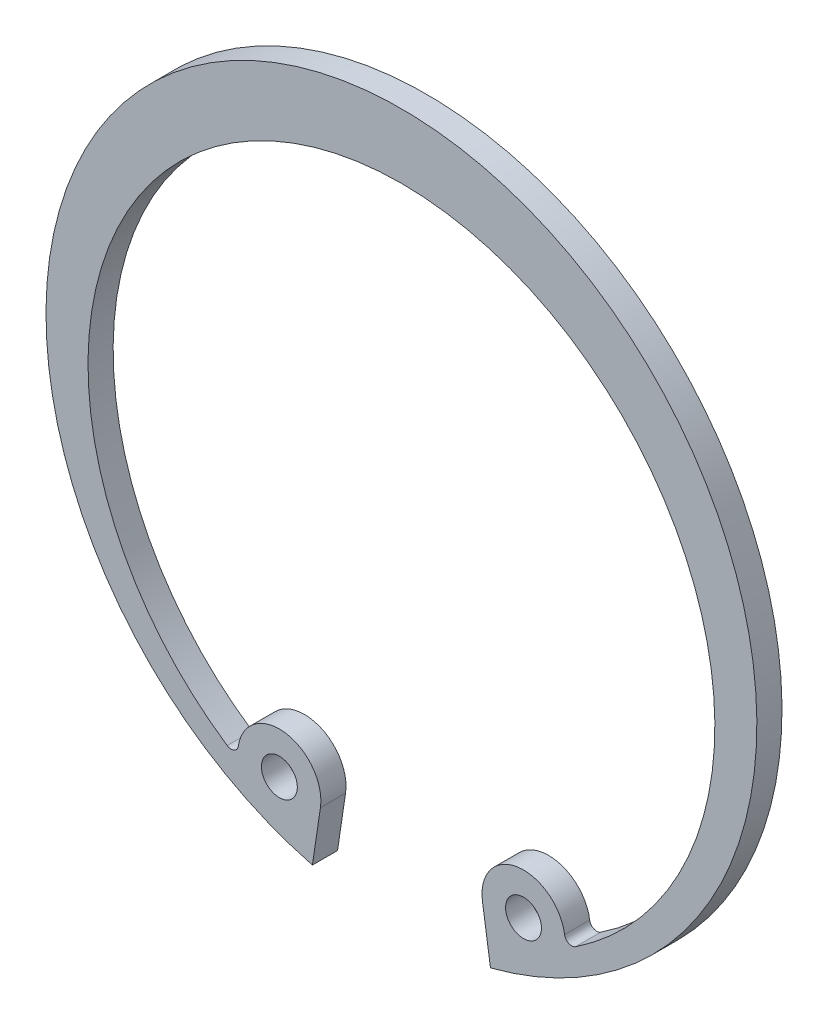
ISO-10303-21;
HEADER;
FILE_DESCRIPTION(('STEP AP214'),'2;1');
FILE_NAME('part.step','',(''),(''),'','','');
FILE_SCHEMA(('AUTOMOTIVE_DESIGN { 1 0 10303 214 1 1 1 1 }'));
ENDSEC;
DATA;
#1=APPLICATION_CONTEXT('core data for automotive mechanical design processes');
#2=APPLICATION_PROTOCOL_DEFINITION('international standard','automotive_design',2000,#1);
#3=PRODUCT_CONTEXT('',#1,'mechanical');
#4=PRODUCT('Part','Part','',(#3));
#5=PRODUCT_RELATED_PRODUCT_CATEGORY('part','',(#4));
#6=PRODUCT_DEFINITION_FORMATION('','',#4);
#7=PRODUCT_DEFINITION_CONTEXT('part definition',#1,'design');
#8=PRODUCT_DEFINITION('design','',#6,#7);
#9=PRODUCT_DEFINITION_SHAPE('','',#8);
#10=(LENGTH_UNIT() NAMED_UNIT(*) SI_UNIT(.MILLI.,.METRE.));
#11=(NAMED_UNIT(*) PLANE_ANGLE_UNIT() SI_UNIT($,.RADIAN.));
#12=(NAMED_UNIT(*) SI_UNIT($,.STERADIAN.) SOLID_ANGLE_UNIT());
#13=UNCERTAINTY_MEASURE_WITH_UNIT(LENGTH_MEASURE(1.E-05),#10,'distance_accuracy_value','');
#14=(GEOMETRIC_REPRESENTATION_CONTEXT(3) GLOBAL_UNCERTAINTY_ASSIGNED_CONTEXT((#13)) GLOBAL_UNIT_ASSIGNED_CONTEXT((#10,
#11,#12)) REPRESENTATION_CONTEXT('',''));
#15=CARTESIAN_POINT('',(0.,0.,0.));
#16=DIRECTION('',(0.,0.,1.));
#17=DIRECTION('',(1.,0.,0.));
#18=AXIS2_PLACEMENT_3D('',#15,#16,#17);
#19=CARTESIAN_POINT('',(-8.5,-19.7928377926956,1.75));
#20=DIRECTION('',(0.,0.,1.));
#21=DIRECTION('',(1.,0.,0.));
#22=AXIS2_PLACEMENT_3D('',#19,#20,#21);
#23=PLANE('',#22);
#24=CARTESIAN_POINT('',(-8.5,-19.7928377926956,1.75));
#25=DIRECTION('',(0.,0.,1.));
#26=DIRECTION('',(1.,0.,0.));
#27=AXIS2_PLACEMENT_3D('',#24,#25,#26);
#28=CIRCLE('',#27,1.25);
#29=CARTESIAN_POINT('',(-7.25,-19.7928377926956,1.75));
#30=VERTEX_POINT('',#29);
#31=EDGE_CURVE('E136',#30,#30,#28,.T.);
#32=ORIENTED_EDGE('',*,*,#31,.F.);
#33=EDGE_LOOP('',(#32));
#34=FACE_BOUND('',#33,.T.);
#35=CARTESIAN_POINT('',(-8.5,-19.7928377926956,1.75));
#36=DIRECTION('',(0.,0.,1.));
#37=DIRECTION('',(1.,0.,0.));
#38=AXIS2_PLACEMENT_3D('',#35,#36,#37);
#39=CIRCLE('',#38,2.89080843162481);
#40=CARTESIAN_POINT('',(-5.64094460318268,-20.2201264846626,1.75));
#41=VERTEX_POINT('',#40);
#42=CARTESIAN_POINT('',(-11.3602513121852,-19.3736292294532,1.75));
#43=VERTEX_POINT('',#42);
#44=EDGE_CURVE('E147',#41,#43,#39,.T.);
#45=ORIENTED_EDGE('',*,*,#44,.T.);
#46=CARTESIAN_POINT('',(-11.8549660917768,-19.3011220790906,1.75));
#47=DIRECTION('',(0.,0.,-1.));
#48=DIRECTION('',(1.,0.,0.));
#49=AXIS2_PLACEMENT_3D('',#46,#47,#48);
#50=CIRCLE('',#49,0.500000000000004);
#51=CARTESIAN_POINT('',(-12.1329254374222,-19.7167404162322,1.75));
#52=VERTEX_POINT('',#51);
#53=EDGE_CURVE('E95',#43,#52,#50,.T.);
#54=ORIENTED_EDGE('',*,*,#53,.T.);
#55=CARTESIAN_POINT('',(0.,-1.575,1.75));
#56=DIRECTION('',(0.,0.,-1.));
#57=DIRECTION('',(1.,0.,0.));
#58=AXIS2_PLACEMENT_3D('',#55,#56,#57);
#59=CIRCLE('',#58,21.825);
#60=CARTESIAN_POINT('',(12.1329254374222,-19.7167404162322,1.75));
#61=VERTEX_POINT('',#60);
#62=EDGE_CURVE('E162',#52,#61,#59,.T.);
#63=ORIENTED_EDGE('',*,*,#62,.T.);
#64=CARTESIAN_POINT('',(11.8549660917768,-19.3011220790906,1.75));
#65=DIRECTION('',(0.,0.,-1.));
#66=DIRECTION('',(-1.,0.,0.));
#67=AXIS2_PLACEMENT_3D('',#64,#65,#66);
#68=CIRCLE('',#67,0.500000000000004);
#69=CARTESIAN_POINT('',(11.3602513121852,-19.3736292294532,1.75));
#70=VERTEX_POINT('',#69);
#71=EDGE_CURVE('E175',#61,#70,#68,.T.);
#72=ORIENTED_EDGE('',*,*,#71,.T.);
#73=CARTESIAN_POINT('',(8.5,-19.7928377926956,1.75));
#74=DIRECTION('',(0.,0.,1.));
#75=DIRECTION('',(1.,0.,0.));
#76=AXIS2_PLACEMENT_3D('',#73,#74,#75);
#77=CIRCLE('',#76,2.89080843162481);
#78=CARTESIAN_POINT('',(5.64094460318268,-20.2201264846626,1.75));
#79=VERTEX_POINT('',#78);
#80=EDGE_CURVE('E114',#70,#79,#77,.T.);
#81=ORIENTED_EDGE('',*,*,#80,.T.);
#82=DIRECTION('',(0.147809411129611,-0.989015863361917,0.));
#83=VECTOR('',#82,1.);
#84=CARTESIAN_POINT('',(5.64094460318268,-20.2201264846626,1.75));
#85=LINE('',#84,#83);
#86=CARTESIAN_POINT('',(6.19999999999999,-23.9608534906418,1.75));
#87=VERTEX_POINT('',#86);
#88=EDGE_CURVE('E108',#79,#87,#85,.T.);
#89=ORIENTED_EDGE('',*,*,#88,.T.);
#90=CARTESIAN_POINT('',(0.,0.,1.75));
#91=DIRECTION('',(0.,0.,1.));
#92=DIRECTION('',(1.,0.,0.));
#93=AXIS2_PLACEMENT_3D('',#90,#91,#92);
#94=CIRCLE('',#93,24.75);
#95=CARTESIAN_POINT('',(-6.2,-23.9608534906418,1.75));
#96=VERTEX_POINT('',#95);
#97=EDGE_CURVE('E112',#87,#96,#94,.T.);
#98=ORIENTED_EDGE('',*,*,#97,.T.);
#99=DIRECTION('',(0.147809411129611,0.989015863361917,0.));
#100=VECTOR('',#99,1.);
#101=CARTESIAN_POINT('',(-5.64094460318268,-20.2201264846626,1.75));
#102=LINE('',#101,#100);
#103=EDGE_CURVE('E52',#96,#41,#102,.T.);
#104=ORIENTED_EDGE('',*,*,#103,.T.);
#105=EDGE_LOOP('',(#45,#54,#63,#72,#81,#89,#98,#104));
#106=FACE_BOUND('',#105,.T.);
#107=CARTESIAN_POINT('',(8.5,-19.7928377926956,1.75));
#108=DIRECTION('',(0.,0.,1.));
#109=DIRECTION('',(1.,0.,0.));
#110=AXIS2_PLACEMENT_3D('',#107,#108,#109);
#111=CIRCLE('',#110,1.25);
#112=CARTESIAN_POINT('',(9.75,-19.7928377926956,1.75));
#113=VERTEX_POINT('',#112);
#114=EDGE_CURVE('E184',#113,#113,#111,.T.);
#115=ORIENTED_EDGE('',*,*,#114,.F.);
#116=EDGE_LOOP('',(#115));
#117=FACE_BOUND('',#116,.T.);
#118=ADVANCED_FACE('F35',(#34,#106,#117),#23,.T.);
#119=CARTESIAN_POINT('',(-8.5,-19.7928377926956,0.));
#120=DIRECTION('',(0.,0.,1.));
#121=DIRECTION('',(1.,0.,0.));
#122=AXIS2_PLACEMENT_3D('',#119,#120,#121);
#123=PLANE('',#122);
#124=CARTESIAN_POINT('',(-8.5,-19.7928377926956,0.));
#125=DIRECTION('',(0.,0.,1.));
#126=DIRECTION('',(1.,0.,0.));
#127=AXIS2_PLACEMENT_3D('',#124,#125,#126);
#128=CIRCLE('',#127,2.89080843162481);
#129=CARTESIAN_POINT('',(-5.64094460318268,-20.2201264846626,0.));
#130=VERTEX_POINT('',#129);
#131=CARTESIAN_POINT('',(-11.3602513121852,-19.3736292294532,0.));
#132=VERTEX_POINT('',#131);
#133=EDGE_CURVE('E132',#130,#132,#128,.T.);
#134=ORIENTED_EDGE('',*,*,#133,.F.);
#135=DIRECTION('',(0.147809411129611,0.989015863361917,0.));
#136=VECTOR('',#135,1.);
#137=CARTESIAN_POINT('',(-5.64094460318268,-20.2201264846626,0.));
#138=LINE('',#137,#136);
#139=CARTESIAN_POINT('',(-6.2,-23.9608534906418,0.));
#140=VERTEX_POINT('',#139);
#141=EDGE_CURVE('E87',#140,#130,#138,.T.);
#142=ORIENTED_EDGE('',*,*,#141,.F.);
#143=CARTESIAN_POINT('',(0.,0.,0.));
#144=DIRECTION('',(0.,0.,1.));
#145=DIRECTION('',(1.,0.,0.));
#146=AXIS2_PLACEMENT_3D('',#143,#144,#145);
#147=CIRCLE('',#146,24.75);
#148=CARTESIAN_POINT('',(6.19999999999999,-23.9608534906418,0.));
#149=VERTEX_POINT('',#148);
#150=EDGE_CURVE('E81',#149,#140,#147,.T.);
#151=ORIENTED_EDGE('',*,*,#150,.F.);
#152=DIRECTION('',(0.147809411129611,-0.989015863361917,0.));
#153=VECTOR('',#152,1.);
#154=CARTESIAN_POINT('',(5.64094460318268,-20.2201264846626,0.));
#155=LINE('',#154,#153);
#156=CARTESIAN_POINT('',(5.64094460318268,-20.2201264846626,0.));
#157=VERTEX_POINT('',#156);
#158=EDGE_CURVE('E122',#157,#149,#155,.T.);
#159=ORIENTED_EDGE('',*,*,#158,.F.);
#160=CARTESIAN_POINT('',(8.5,-19.7928377926956,0.));
#161=DIRECTION('',(0.,0.,1.));
#162=DIRECTION('',(1.,0.,0.));
#163=AXIS2_PLACEMENT_3D('',#160,#161,#162);
#164=CIRCLE('',#163,2.89080843162481);
#165=CARTESIAN_POINT('',(11.3602513121852,-19.3736292294532,0.));
#166=VERTEX_POINT('',#165);
#167=EDGE_CURVE('E142',#166,#157,#164,.T.);
#168=ORIENTED_EDGE('',*,*,#167,.F.);
#169=CARTESIAN_POINT('',(11.8549660917768,-19.3011220790906,0.));
#170=DIRECTION('',(0.,0.,-1.));
#171=DIRECTION('',(-1.,0.,0.));
#172=AXIS2_PLACEMENT_3D('',#169,#170,#171);
#173=CIRCLE('',#172,0.500000000000004);
#174=CARTESIAN_POINT('',(12.1329254374222,-19.7167404162322,0.));
#175=VERTEX_POINT('',#174);
#176=EDGE_CURVE('E140',#175,#166,#173,.T.);
#177=ORIENTED_EDGE('',*,*,#176,.F.);
#178=CARTESIAN_POINT('',(0.,-1.575,0.));
#179=DIRECTION('',(0.,0.,-1.));
#180=DIRECTION('',(1.,0.,0.));
#181=AXIS2_PLACEMENT_3D('',#178,#179,#180);
#182=CIRCLE('',#181,21.825);
#183=CARTESIAN_POINT('',(-12.1329254374222,-19.7167404162322,0.));
#184=VERTEX_POINT('',#183);
#185=EDGE_CURVE('E138',#184,#175,#182,.T.);
#186=ORIENTED_EDGE('',*,*,#185,.F.);
#187=CARTESIAN_POINT('',(-11.8549660917768,-19.3011220790906,0.));
#188=DIRECTION('',(0.,0.,-1.));
#189=DIRECTION('',(1.,0.,0.));
#190=AXIS2_PLACEMENT_3D('',#187,#188,#189);
#191=CIRCLE('',#190,0.500000000000004);
#192=EDGE_CURVE('E135',#132,#184,#191,.T.);
#193=ORIENTED_EDGE('',*,*,#192,.F.);
#194=EDGE_LOOP('',(#134,#142,#151,#159,#168,#177,#186,#193));
#195=FACE_BOUND('',#194,.T.);
#196=CARTESIAN_POINT('',(-8.5,-19.7928377926956,0.));
#197=DIRECTION('',(0.,0.,1.));
#198=DIRECTION('',(1.,0.,0.));
#199=AXIS2_PLACEMENT_3D('',#196,#197,#198);
#200=CIRCLE('',#199,1.25);
#201=CARTESIAN_POINT('',(-7.25,-19.7928377926956,0.));
#202=VERTEX_POINT('',#201);
#203=EDGE_CURVE('E181',#202,#202,#200,.T.);
#204=ORIENTED_EDGE('',*,*,#203,.T.);
#205=EDGE_LOOP('',(#204));
#206=FACE_BOUND('',#205,.T.);
#207=CARTESIAN_POINT('',(8.5,-19.7928377926956,0.));
#208=DIRECTION('',(0.,0.,1.));
#209=DIRECTION('',(1.,0.,0.));
#210=AXIS2_PLACEMENT_3D('',#207,#208,#209);
#211=CIRCLE('',#210,1.25);
#212=CARTESIAN_POINT('',(9.75,-19.7928377926956,0.));
#213=VERTEX_POINT('',#212);
#214=EDGE_CURVE('E187',#213,#213,#211,.T.);
#215=ORIENTED_EDGE('',*,*,#214,.T.);
#216=EDGE_LOOP('',(#215));
#217=FACE_BOUND('',#216,.T.);
#218=ADVANCED_FACE('F166',(#195,#206,#217),#123,.F.);
#219=CARTESIAN_POINT('',(-8.5,-19.7928377926956,1.75));
#220=DIRECTION('',(0.,0.,-1.));
#221=DIRECTION('',(-1.,0.,0.));
#222=AXIS2_PLACEMENT_3D('',#219,#220,#221);
#223=CYLINDRICAL_SURFACE('',#222,2.89080843162481);
#224=ORIENTED_EDGE('',*,*,#133,.T.);
#225=DIRECTION('',(0.,0.,-1.));
#226=VECTOR('',#225,1.);
#227=CARTESIAN_POINT('',(-11.3602513121852,-19.3736292294532,1.75));
#228=LINE('',#227,#226);
#229=EDGE_CURVE('E11',#43,#132,#228,.T.);
#230=ORIENTED_EDGE('',*,*,#229,.F.);
#231=ORIENTED_EDGE('',*,*,#44,.F.);
#232=DIRECTION('',(0.,0.,-1.));
#233=VECTOR('',#232,1.);
#234=CARTESIAN_POINT('',(-5.64094460318268,-20.2201264846626,1.75));
#235=LINE('',#234,#233);
#236=EDGE_CURVE('E128',#41,#130,#235,.T.);
#237=ORIENTED_EDGE('',*,*,#236,.T.);
#238=EDGE_LOOP('',(#224,#230,#231,#237));
#239=FACE_BOUND('',#238,.T.);
#240=ADVANCED_FACE('F37',(#239),#223,.T.);
#241=CARTESIAN_POINT('',(-11.8549660917768,-19.3011220790906,1.75));
#242=DIRECTION('',(0.,0.,-1.));
#243=DIRECTION('',(-1.,0.,0.));
#244=AXIS2_PLACEMENT_3D('',#241,#242,#243);
#245=CYLINDRICAL_SURFACE('',#244,0.500000000000004);
#246=ORIENTED_EDGE('',*,*,#192,.T.);
#247=DIRECTION('',(0.,0.,-1.));
#248=VECTOR('',#247,1.);
#249=CARTESIAN_POINT('',(-12.1329254374222,-19.7167404162322,1.75));
#250=LINE('',#249,#248);
#251=EDGE_CURVE('E44',#52,#184,#250,.T.);
#252=ORIENTED_EDGE('',*,*,#251,.F.);
#253=ORIENTED_EDGE('',*,*,#53,.F.);
#254=ORIENTED_EDGE('',*,*,#229,.T.);
#255=EDGE_LOOP('',(#246,#252,#253,#254));
#256=FACE_BOUND('',#255,.T.);
#257=ADVANCED_FACE('F219',(#256),#245,.F.);
#258=CARTESIAN_POINT('',(0.,-1.575,1.75));
#259=DIRECTION('',(0.,0.,-1.));
#260=DIRECTION('',(-1.,0.,0.));
#261=AXIS2_PLACEMENT_3D('',#258,#259,#260);
#262=CYLINDRICAL_SURFACE('',#261,21.825);
#263=ORIENTED_EDGE('',*,*,#185,.T.);
#264=DIRECTION('',(0.,0.,-1.));
#265=VECTOR('',#264,1.);
#266=CARTESIAN_POINT('',(12.1329254374222,-19.7167404162322,1.75));
#267=LINE('',#266,#265);
#268=EDGE_CURVE('E154',#61,#175,#267,.T.);
#269=ORIENTED_EDGE('',*,*,#268,.F.);
#270=ORIENTED_EDGE('',*,*,#62,.F.);
#271=ORIENTED_EDGE('',*,*,#251,.T.);
#272=EDGE_LOOP('',(#263,#269,#270,#271));
#273=FACE_BOUND('',#272,.T.);
#274=ADVANCED_FACE('F160',(#273),#262,.F.);
#275=CARTESIAN_POINT('',(11.8549660917768,-19.3011220790906,1.75));
#276=DIRECTION('',(0.,0.,-1.));
#277=DIRECTION('',(-1.,0.,0.));
#278=AXIS2_PLACEMENT_3D('',#275,#276,#277);
#279=CYLINDRICAL_SURFACE('',#278,0.500000000000004);
#280=ORIENTED_EDGE('',*,*,#176,.T.);
#281=DIRECTION('',(0.,0.,-1.));
#282=VECTOR('',#281,1.);
#283=CARTESIAN_POINT('',(11.3602513121852,-19.3736292294532,1.75));
#284=LINE('',#283,#282);
#285=EDGE_CURVE('E151',#70,#166,#284,.T.);
#286=ORIENTED_EDGE('',*,*,#285,.F.);
#287=ORIENTED_EDGE('',*,*,#71,.F.);
#288=ORIENTED_EDGE('',*,*,#268,.T.);
#289=EDGE_LOOP('',(#280,#286,#287,#288));
#290=FACE_BOUND('',#289,.T.);
#291=ADVANCED_FACE('F171',(#290),#279,.F.);
#292=CARTESIAN_POINT('',(8.5,-19.7928377926956,1.75));
#293=DIRECTION('',(0.,0.,-1.));
#294=DIRECTION('',(-1.,0.,0.));
#295=AXIS2_PLACEMENT_3D('',#292,#293,#294);
#296=CYLINDRICAL_SURFACE('',#295,2.89080843162481);
#297=ORIENTED_EDGE('',*,*,#167,.T.);
#298=DIRECTION('',(0.,0.,-1.));
#299=VECTOR('',#298,1.);
#300=CARTESIAN_POINT('',(5.64094460318268,-20.2201264846626,1.75));
#301=LINE('',#300,#299);
#302=EDGE_CURVE('E123',#79,#157,#301,.T.);
#303=ORIENTED_EDGE('',*,*,#302,.F.);
#304=ORIENTED_EDGE('',*,*,#80,.F.);
#305=ORIENTED_EDGE('',*,*,#285,.T.);
#306=EDGE_LOOP('',(#297,#303,#304,#305));
#307=FACE_BOUND('',#306,.T.);
#308=ADVANCED_FACE('F174',(#307),#296,.T.);
#309=CARTESIAN_POINT('',(5.64094460318268,-20.2201264846626,1.75));
#310=DIRECTION('',(0.989015863361917,0.147809411129611,0.));
#311=DIRECTION('',(-0.147809411129611,0.989015863361917,0.));
#312=AXIS2_PLACEMENT_3D('',#309,#310,#311);
#313=PLANE('',#312);
#314=ORIENTED_EDGE('',*,*,#158,.T.);
#315=DIRECTION('',(0.,0.,-1.));
#316=VECTOR('',#315,1.);
#317=CARTESIAN_POINT('',(6.19999999999999,-23.9608534906418,1.75));
#318=LINE('',#317,#316);
#319=EDGE_CURVE('E119',#87,#149,#318,.T.);
#320=ORIENTED_EDGE('',*,*,#319,.F.);
#321=ORIENTED_EDGE('',*,*,#88,.F.);
#322=ORIENTED_EDGE('',*,*,#302,.T.);
#323=EDGE_LOOP('',(#314,#320,#321,#322));
#324=FACE_BOUND('',#323,.T.);
#325=ADVANCED_FACE('F120',(#324),#313,.F.);
#326=CARTESIAN_POINT('',(0.,0.,1.75));
#327=DIRECTION('',(0.,0.,-1.));
#328=DIRECTION('',(-1.,0.,0.));
#329=AXIS2_PLACEMENT_3D('',#326,#327,#328);
#330=CYLINDRICAL_SURFACE('',#329,24.75);
#331=ORIENTED_EDGE('',*,*,#150,.T.);
#332=DIRECTION('',(0.,0.,-1.));
#333=VECTOR('',#332,1.);
#334=CARTESIAN_POINT('',(-6.2,-23.9608534906418,1.75));
#335=LINE('',#334,#333);
#336=EDGE_CURVE('E124',#96,#140,#335,.T.);
#337=ORIENTED_EDGE('',*,*,#336,.F.);
#338=ORIENTED_EDGE('',*,*,#97,.F.);
#339=ORIENTED_EDGE('',*,*,#319,.T.);
#340=EDGE_LOOP('',(#331,#337,#338,#339));
#341=FACE_BOUND('',#340,.T.);
#342=ADVANCED_FACE('F126',(#341),#330,.T.);
#343=CARTESIAN_POINT('',(-5.64094460318268,-20.2201264846626,1.75));
#344=DIRECTION('',(-0.989015863361917,0.147809411129611,0.));
#345=DIRECTION('',(-0.147809411129611,-0.989015863361917,0.));
#346=AXIS2_PLACEMENT_3D('',#343,#344,#345);
#347=PLANE('',#346);
#348=ORIENTED_EDGE('',*,*,#141,.T.);
#349=ORIENTED_EDGE('',*,*,#236,.F.);
#350=ORIENTED_EDGE('',*,*,#103,.F.);
#351=ORIENTED_EDGE('',*,*,#336,.T.);
#352=EDGE_LOOP('',(#348,#349,#350,#351));
#353=FACE_BOUND('',#352,.T.);
#354=ADVANCED_FACE('F207',(#353),#347,.F.);
#355=CARTESIAN_POINT('',(-8.5,-19.7928377926956,1.75));
#356=DIRECTION('',(0.,0.,-1.));
#357=DIRECTION('',(-1.,0.,0.));
#358=AXIS2_PLACEMENT_3D('',#355,#356,#357);
#359=CYLINDRICAL_SURFACE('',#358,1.25);
#360=ORIENTED_EDGE('',*,*,#31,.T.);
#361=EDGE_LOOP('',(#360));
#362=FACE_BOUND('',#361,.T.);
#363=ORIENTED_EDGE('',*,*,#203,.F.);
#364=EDGE_LOOP('',(#363));
#365=FACE_BOUND('',#364,.T.);
#366=ADVANCED_FACE('F204',(#362,#365),#359,.F.);
#367=CARTESIAN_POINT('',(8.5,-19.7928377926956,1.75));
#368=DIRECTION('',(0.,0.,-1.));
#369=DIRECTION('',(-1.,0.,0.));
#370=AXIS2_PLACEMENT_3D('',#367,#368,#369);
#371=CYLINDRICAL_SURFACE('',#370,1.25);
#372=ORIENTED_EDGE('',*,*,#114,.T.);
#373=EDGE_LOOP('',(#372));
#374=FACE_BOUND('',#373,.T.);
#375=ORIENTED_EDGE('',*,*,#214,.F.);
#376=EDGE_LOOP('',(#375));
#377=FACE_BOUND('',#376,.T.);
#378=ADVANCED_FACE('F193',(#374,#377),#371,.F.);
#379=CLOSED_SHELL('',(#118,#218,#240,#257,#274,#291,#308,#325,#342,#354,#366,#378));
#380=MANIFOLD_SOLID_BREP('B2',#379);
#381=ADVANCED_BREP_SHAPE_REPRESENTATION('',(#18,#380),#14);
#382=SHAPE_DEFINITION_REPRESENTATION(#9,#381);
ENDSEC;
END-ISO-10303-21;
